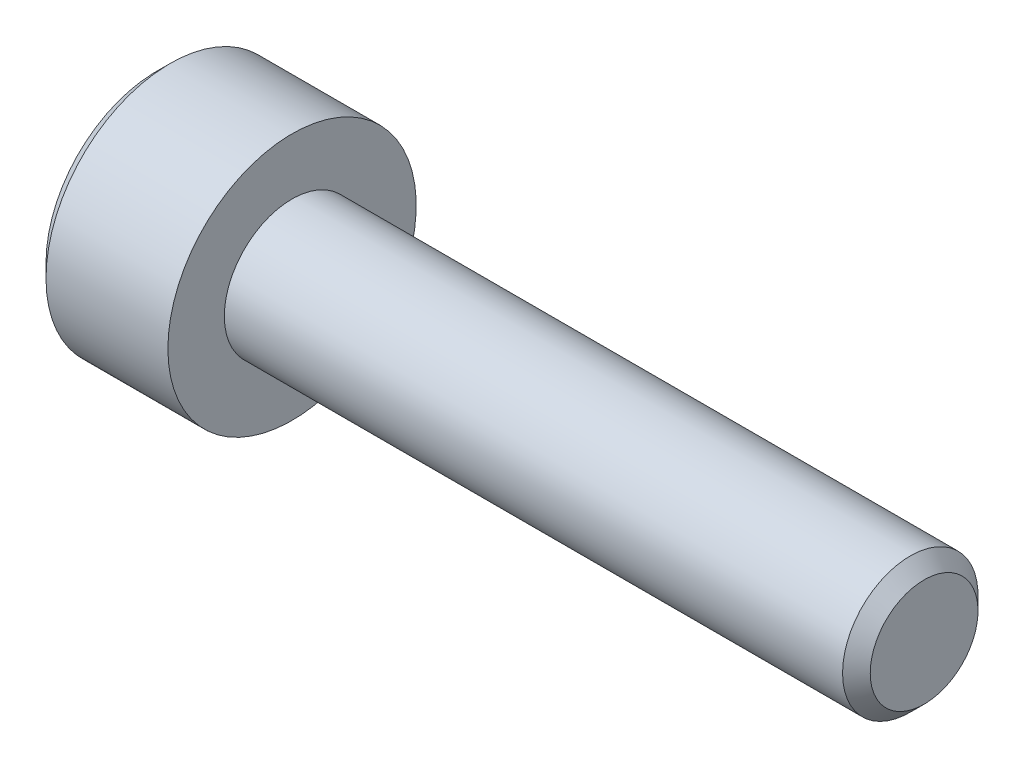
ISO-10303-21;
HEADER;
FILE_DESCRIPTION(('STEP AP214'),'2;1');
FILE_NAME('part.step','',(''),(''),'','','');
FILE_SCHEMA(('AUTOMOTIVE_DESIGN { 1 0 10303 214 1 1 1 1 }'));
ENDSEC;
DATA;
#1=APPLICATION_CONTEXT('core data for automotive mechanical design processes');
#2=APPLICATION_PROTOCOL_DEFINITION('international standard','automotive_design',2000,#1);
#3=PRODUCT_CONTEXT('',#1,'mechanical');
#4=PRODUCT('Part','Part','',(#3));
#5=PRODUCT_RELATED_PRODUCT_CATEGORY('part','',(#4));
#6=PRODUCT_DEFINITION_FORMATION('','',#4);
#7=PRODUCT_DEFINITION_CONTEXT('part definition',#1,'design');
#8=PRODUCT_DEFINITION('design','',#6,#7);
#9=PRODUCT_DEFINITION_SHAPE('','',#8);
#10=(LENGTH_UNIT() NAMED_UNIT(*) SI_UNIT(.MILLI.,.METRE.));
#11=(NAMED_UNIT(*) PLANE_ANGLE_UNIT() SI_UNIT($,.RADIAN.));
#12=(NAMED_UNIT(*) SI_UNIT($,.STERADIAN.) SOLID_ANGLE_UNIT());
#13=UNCERTAINTY_MEASURE_WITH_UNIT(LENGTH_MEASURE(1.E-05),#10,'distance_accuracy_value','');
#14=(GEOMETRIC_REPRESENTATION_CONTEXT(3) GLOBAL_UNCERTAINTY_ASSIGNED_CONTEXT((#13)) GLOBAL_UNIT_ASSIGNED_CONTEXT((#10,
#11,#12)) REPRESENTATION_CONTEXT('',''));
#15=CARTESIAN_POINT('',(0.,0.,0.));
#16=DIRECTION('',(0.,0.,1.));
#17=DIRECTION('',(1.,0.,0.));
#18=AXIS2_PLACEMENT_3D('',#15,#16,#17);
#19=CARTESIAN_POINT('',(-3.,-2.45000000000001,0.));
#20=DIRECTION('',(-1.,0.,0.));
#21=DIRECTION('',(0.,0.,1.));
#22=AXIS2_PLACEMENT_3D('',#19,#20,#21);
#23=PLANE('',#22);
#24=DIRECTION('',(0.,0.5,-0.866025403784439));
#25=VECTOR('',#24,1.);
#26=CARTESIAN_POINT('',(-3.,0.721687836487033,1.25));
#27=LINE('',#26,#25);
#28=CARTESIAN_POINT('',(-3.,0.721687836487033,1.25));
#29=VERTEX_POINT('',#28);
#30=CARTESIAN_POINT('',(-3.,1.44337567297406,0.));
#31=VERTEX_POINT('',#30);
#32=EDGE_CURVE('E59',#29,#31,#27,.T.);
#33=ORIENTED_EDGE('',*,*,#32,.F.);
#34=DIRECTION('',(0.,1.,0.));
#35=VECTOR('',#34,1.);
#36=CARTESIAN_POINT('',(-3.,-0.721687836487033,1.25));
#37=LINE('',#36,#35);
#38=CARTESIAN_POINT('',(-3.,-0.721687836487033,1.25));
#39=VERTEX_POINT('',#38);
#40=EDGE_CURVE('E142',#39,#29,#37,.T.);
#41=ORIENTED_EDGE('',*,*,#40,.F.);
#42=DIRECTION('',(0.,0.5,0.866025403784439));
#43=VECTOR('',#42,1.);
#44=CARTESIAN_POINT('',(-3.,-1.44337567297406,0.));
#45=LINE('',#44,#43);
#46=CARTESIAN_POINT('',(-3.,-1.44337567297406,0.));
#47=VERTEX_POINT('',#46);
#48=EDGE_CURVE('E140',#47,#39,#45,.T.);
#49=ORIENTED_EDGE('',*,*,#48,.F.);
#50=DIRECTION('',(0.,-0.5,0.866025403784439));
#51=VECTOR('',#50,1.);
#52=CARTESIAN_POINT('',(-3.,-0.721687836487032,-1.25));
#53=LINE('',#52,#51);
#54=CARTESIAN_POINT('',(-3.,-0.721687836487032,-1.25));
#55=VERTEX_POINT('',#54);
#56=EDGE_CURVE('E107',#55,#47,#53,.T.);
#57=ORIENTED_EDGE('',*,*,#56,.F.);
#58=DIRECTION('',(0.,-1.,0.));
#59=VECTOR('',#58,1.);
#60=CARTESIAN_POINT('',(-3.,0.721687836487033,-1.25));
#61=LINE('',#60,#59);
#62=CARTESIAN_POINT('',(-3.,0.721687836487033,-1.25));
#63=VERTEX_POINT('',#62);
#64=EDGE_CURVE('E136',#63,#55,#61,.T.);
#65=ORIENTED_EDGE('',*,*,#64,.F.);
#66=DIRECTION('',(0.,-0.5,-0.866025403784439));
#67=VECTOR('',#66,1.);
#68=CARTESIAN_POINT('',(-3.,1.44337567297406,0.));
#69=LINE('',#68,#67);
#70=EDGE_CURVE('E133',#31,#63,#69,.T.);
#71=ORIENTED_EDGE('',*,*,#70,.F.);
#72=EDGE_LOOP('',(#33,#41,#49,#57,#65,#71));
#73=FACE_BOUND('',#72,.T.);
#74=CARTESIAN_POINT('',(-3.,0.,0.));
#75=DIRECTION('',(-1.,0.,0.));
#76=DIRECTION('',(0.,0.,1.));
#77=AXIS2_PLACEMENT_3D('',#74,#75,#76);
#78=CIRCLE('',#77,2.45000000000001);
#79=CARTESIAN_POINT('',(-3.,0.,2.45000000000001));
#80=VERTEX_POINT('',#79);
#81=EDGE_CURVE('E146',#80,#80,#78,.T.);
#82=ORIENTED_EDGE('',*,*,#81,.T.);
#83=EDGE_LOOP('',(#82));
#84=FACE_BOUND('',#83,.T.);
#85=ADVANCED_FACE('F45',(#73,#84),#23,.T.);
#86=CARTESIAN_POINT('',(14.,0.,0.));
#87=DIRECTION('',(1.,0.,0.));
#88=DIRECTION('',(0.,0.,-1.));
#89=AXIS2_PLACEMENT_3D('',#86,#87,#88);
#90=PLANE('',#89);
#91=CARTESIAN_POINT('',(14.,0.,0.));
#92=DIRECTION('',(-1.,0.,0.));
#93=DIRECTION('',(0.,0.,1.));
#94=AXIS2_PLACEMENT_3D('',#91,#92,#93);
#95=CIRCLE('',#94,1.1935);
#96=CARTESIAN_POINT('',(14.,0.,1.1935));
#97=VERTEX_POINT('',#96);
#98=EDGE_CURVE('E11',#97,#97,#95,.T.);
#99=ORIENTED_EDGE('',*,*,#98,.F.);
#100=EDGE_LOOP('',(#99));
#101=FACE_BOUND('',#100,.T.);
#102=ADVANCED_FACE('F170',(#101),#90,.T.);
#103=CARTESIAN_POINT('',(13.6935,0.,0.));
#104=DIRECTION('',(-1.,0.,0.));
#105=DIRECTION('',(0.,0.,1.));
#106=AXIS2_PLACEMENT_3D('',#103,#104,#105);
#107=CONICAL_SURFACE('',#106,1.5,0.785398163397452);
#108=ORIENTED_EDGE('',*,*,#98,.T.);
#109=EDGE_LOOP('',(#108));
#110=FACE_BOUND('',#109,.T.);
#111=CARTESIAN_POINT('',(13.6935,0.,0.));
#112=DIRECTION('',(-1.,0.,0.));
#113=DIRECTION('',(0.,0.,1.));
#114=AXIS2_PLACEMENT_3D('',#111,#112,#113);
#115=CIRCLE('',#114,1.5);
#116=CARTESIAN_POINT('',(13.6935,0.,1.5));
#117=VERTEX_POINT('',#116);
#118=EDGE_CURVE('E52',#117,#117,#115,.T.);
#119=ORIENTED_EDGE('',*,*,#118,.F.);
#120=EDGE_LOOP('',(#119));
#121=FACE_BOUND('',#120,.T.);
#122=ADVANCED_FACE('F168',(#110,#121),#107,.T.);
#123=CARTESIAN_POINT('',(-3.85,0.,0.));
#124=DIRECTION('',(-1.,0.,0.));
#125=DIRECTION('',(0.,0.,1.));
#126=AXIS2_PLACEMENT_3D('',#123,#124,#125);
#127=CYLINDRICAL_SURFACE('',#126,1.5);
#128=ORIENTED_EDGE('',*,*,#118,.T.);
#129=EDGE_LOOP('',(#128));
#130=FACE_BOUND('',#129,.T.);
#131=CARTESIAN_POINT('',(0.,0.,0.));
#132=DIRECTION('',(-1.,0.,0.));
#133=DIRECTION('',(0.,0.,1.));
#134=AXIS2_PLACEMENT_3D('',#131,#132,#133);
#135=CIRCLE('',#134,1.5);
#136=CARTESIAN_POINT('',(0.,0.,1.5));
#137=VERTEX_POINT('',#136);
#138=EDGE_CURVE('E160',#137,#137,#135,.T.);
#139=ORIENTED_EDGE('',*,*,#138,.F.);
#140=EDGE_LOOP('',(#139));
#141=FACE_BOUND('',#140,.T.);
#142=ADVANCED_FACE('F165',(#130,#141),#127,.T.);
#143=CARTESIAN_POINT('',(0.,-1.5,0.));
#144=DIRECTION('',(1.,0.,0.));
#145=DIRECTION('',(0.,0.,-1.));
#146=AXIS2_PLACEMENT_3D('',#143,#144,#145);
#147=PLANE('',#146);
#148=ORIENTED_EDGE('',*,*,#138,.T.);
#149=EDGE_LOOP('',(#148));
#150=FACE_BOUND('',#149,.T.);
#151=CARTESIAN_POINT('',(0.,0.,0.));
#152=DIRECTION('',(-1.,0.,0.));
#153=DIRECTION('',(0.,0.,1.));
#154=AXIS2_PLACEMENT_3D('',#151,#152,#153);
#155=CIRCLE('',#154,2.75);
#156=CARTESIAN_POINT('',(0.,0.,2.75));
#157=VERTEX_POINT('',#156);
#158=EDGE_CURVE('E157',#157,#157,#155,.T.);
#159=ORIENTED_EDGE('',*,*,#158,.F.);
#160=EDGE_LOOP('',(#159));
#161=FACE_BOUND('',#160,.T.);
#162=ADVANCED_FACE('F178',(#150,#161),#147,.T.);
#163=CARTESIAN_POINT('',(-3.85,0.,0.));
#164=DIRECTION('',(-1.,0.,0.));
#165=DIRECTION('',(0.,0.,1.));
#166=AXIS2_PLACEMENT_3D('',#163,#164,#165);
#167=CYLINDRICAL_SURFACE('',#166,2.75);
#168=ORIENTED_EDGE('',*,*,#158,.T.);
#169=EDGE_LOOP('',(#168));
#170=FACE_BOUND('',#169,.T.);
#171=CARTESIAN_POINT('',(-2.7,0.,0.));
#172=DIRECTION('',(-1.,0.,0.));
#173=DIRECTION('',(0.,0.,1.));
#174=AXIS2_PLACEMENT_3D('',#171,#172,#173);
#175=CIRCLE('',#174,2.75);
#176=CARTESIAN_POINT('',(-2.7,0.,2.75));
#177=VERTEX_POINT('',#176);
#178=EDGE_CURVE('E154',#177,#177,#175,.T.);
#179=ORIENTED_EDGE('',*,*,#178,.F.);
#180=EDGE_LOOP('',(#179));
#181=FACE_BOUND('',#180,.T.);
#182=ADVANCED_FACE('F194',(#170,#181),#167,.T.);
#183=CARTESIAN_POINT('',(-3.,0.,0.));
#184=DIRECTION('',(1.,0.,0.));
#185=DIRECTION('',(0.,0.,-1.));
#186=AXIS2_PLACEMENT_3D('',#183,#184,#185);
#187=CONICAL_SURFACE('',#186,2.45000000000001,0.785398163397443);
#188=ORIENTED_EDGE('',*,*,#178,.T.);
#189=EDGE_LOOP('',(#188));
#190=FACE_BOUND('',#189,.T.);
#191=ORIENTED_EDGE('',*,*,#81,.F.);
#192=EDGE_LOOP('',(#191));
#193=FACE_BOUND('',#192,.T.);
#194=ADVANCED_FACE('F192',(#190,#193),#187,.T.);
#195=CARTESIAN_POINT('',(-1.5,0.721687836487033,1.25));
#196=DIRECTION('',(0.,0.866025403784439,0.5));
#197=DIRECTION('',(0.,-0.5,0.866025403784439));
#198=AXIS2_PLACEMENT_3D('',#195,#196,#197);
#199=PLANE('',#198);
#200=ORIENTED_EDGE('',*,*,#32,.T.);
#201=DIRECTION('',(-1.,0.,0.));
#202=VECTOR('',#201,1.);
#203=CARTESIAN_POINT('',(-1.5,1.44337567297406,0.));
#204=LINE('',#203,#202);
#205=CARTESIAN_POINT('',(-1.5,1.44337567297406,0.));
#206=VERTEX_POINT('',#205);
#207=EDGE_CURVE('E89',#206,#31,#204,.T.);
#208=ORIENTED_EDGE('',*,*,#207,.F.);
#209=DIRECTION('',(0.,0.5,-0.866025403784439));
#210=VECTOR('',#209,1.);
#211=CARTESIAN_POINT('',(-1.5,0.721687836487033,1.25));
#212=LINE('',#211,#210);
#213=CARTESIAN_POINT('',(-1.5,0.721687836487033,1.25));
#214=VERTEX_POINT('',#213);
#215=EDGE_CURVE('E144',#214,#206,#212,.T.);
#216=ORIENTED_EDGE('',*,*,#215,.F.);
#217=DIRECTION('',(-1.,0.,0.));
#218=VECTOR('',#217,1.);
#219=CARTESIAN_POINT('',(-1.5,0.721687836487033,1.25));
#220=LINE('',#219,#218);
#221=EDGE_CURVE('E67',#214,#29,#220,.T.);
#222=ORIENTED_EDGE('',*,*,#221,.T.);
#223=EDGE_LOOP('',(#200,#208,#216,#222));
#224=FACE_BOUND('',#223,.T.);
#225=ADVANCED_FACE('F193',(#224),#199,.F.);
#226=CARTESIAN_POINT('',(-1.5,-0.721687836487033,1.25));
#227=DIRECTION('',(0.,0.,1.));
#228=DIRECTION('',(0.,-1.,0.));
#229=AXIS2_PLACEMENT_3D('',#226,#227,#228);
#230=PLANE('',#229);
#231=ORIENTED_EDGE('',*,*,#40,.T.);
#232=ORIENTED_EDGE('',*,*,#221,.F.);
#233=DIRECTION('',(0.,1.,0.));
#234=VECTOR('',#233,1.);
#235=CARTESIAN_POINT('',(-1.5,-0.721687836487033,1.25));
#236=LINE('',#235,#234);
#237=CARTESIAN_POINT('',(-1.5,-0.721687836487033,1.25));
#238=VERTEX_POINT('',#237);
#239=EDGE_CURVE('E119',#238,#214,#236,.T.);
#240=ORIENTED_EDGE('',*,*,#239,.F.);
#241=DIRECTION('',(-1.,0.,0.));
#242=VECTOR('',#241,1.);
#243=CARTESIAN_POINT('',(-1.5,-0.721687836487033,1.25));
#244=LINE('',#243,#242);
#245=EDGE_CURVE('E111',#238,#39,#244,.T.);
#246=ORIENTED_EDGE('',*,*,#245,.T.);
#247=EDGE_LOOP('',(#231,#232,#240,#246));
#248=FACE_BOUND('',#247,.T.);
#249=ADVANCED_FACE('F200',(#248),#230,.F.);
#250=CARTESIAN_POINT('',(-1.5,-1.44337567297406,0.));
#251=DIRECTION('',(0.,-0.866025403784439,0.5));
#252=DIRECTION('',(0.,-0.5,-0.866025403784439));
#253=AXIS2_PLACEMENT_3D('',#250,#251,#252);
#254=PLANE('',#253);
#255=ORIENTED_EDGE('',*,*,#48,.T.);
#256=ORIENTED_EDGE('',*,*,#245,.F.);
#257=DIRECTION('',(0.,0.5,0.866025403784439));
#258=VECTOR('',#257,1.);
#259=CARTESIAN_POINT('',(-1.5,-1.44337567297406,0.));
#260=LINE('',#259,#258);
#261=CARTESIAN_POINT('',(-1.5,-1.44337567297406,0.));
#262=VERTEX_POINT('',#261);
#263=EDGE_CURVE('E115',#262,#238,#260,.T.);
#264=ORIENTED_EDGE('',*,*,#263,.F.);
#265=DIRECTION('',(-1.,0.,0.));
#266=VECTOR('',#265,1.);
#267=CARTESIAN_POINT('',(-1.5,-1.44337567297406,0.));
#268=LINE('',#267,#266);
#269=EDGE_CURVE('E100',#262,#47,#268,.T.);
#270=ORIENTED_EDGE('',*,*,#269,.T.);
#271=EDGE_LOOP('',(#255,#256,#264,#270));
#272=FACE_BOUND('',#271,.T.);
#273=ADVANCED_FACE('F116',(#272),#254,.F.);
#274=CARTESIAN_POINT('',(-1.5,-0.721687836487032,-1.25));
#275=DIRECTION('',(0.,-0.866025403784438,-0.5));
#276=DIRECTION('',(0.,0.5,-0.866025403784439));
#277=AXIS2_PLACEMENT_3D('',#274,#275,#276);
#278=PLANE('',#277);
#279=ORIENTED_EDGE('',*,*,#56,.T.);
#280=ORIENTED_EDGE('',*,*,#269,.F.);
#281=DIRECTION('',(0.,-0.5,0.866025403784439));
#282=VECTOR('',#281,1.);
#283=CARTESIAN_POINT('',(-1.5,-0.721687836487032,-1.25));
#284=LINE('',#283,#282);
#285=CARTESIAN_POINT('',(-1.5,-0.721687836487032,-1.25));
#286=VERTEX_POINT('',#285);
#287=EDGE_CURVE('E104',#286,#262,#284,.T.);
#288=ORIENTED_EDGE('',*,*,#287,.F.);
#289=DIRECTION('',(-1.,0.,0.));
#290=VECTOR('',#289,1.);
#291=CARTESIAN_POINT('',(-1.5,-0.721687836487032,-1.25));
#292=LINE('',#291,#290);
#293=EDGE_CURVE('E112',#286,#55,#292,.T.);
#294=ORIENTED_EDGE('',*,*,#293,.T.);
#295=EDGE_LOOP('',(#279,#280,#288,#294));
#296=FACE_BOUND('',#295,.T.);
#297=ADVANCED_FACE('F102',(#296),#278,.F.);
#298=CARTESIAN_POINT('',(-1.5,0.721687836487033,-1.25));
#299=DIRECTION('',(0.,0.,-1.));
#300=DIRECTION('',(-1.,0.,0.));
#301=AXIS2_PLACEMENT_3D('',#298,#299,#300);
#302=PLANE('',#301);
#303=ORIENTED_EDGE('',*,*,#64,.T.);
#304=ORIENTED_EDGE('',*,*,#293,.F.);
#305=DIRECTION('',(0.,-1.,0.));
#306=VECTOR('',#305,1.);
#307=CARTESIAN_POINT('',(-1.5,0.721687836487033,-1.25));
#308=LINE('',#307,#306);
#309=CARTESIAN_POINT('',(-1.5,0.721687836487033,-1.25));
#310=VERTEX_POINT('',#309);
#311=EDGE_CURVE('E125',#310,#286,#308,.T.);
#312=ORIENTED_EDGE('',*,*,#311,.F.);
#313=DIRECTION('',(-1.,0.,0.));
#314=VECTOR('',#313,1.);
#315=CARTESIAN_POINT('',(-1.5,0.721687836487033,-1.25));
#316=LINE('',#315,#314);
#317=EDGE_CURVE('E149',#310,#63,#316,.T.);
#318=ORIENTED_EDGE('',*,*,#317,.T.);
#319=EDGE_LOOP('',(#303,#304,#312,#318));
#320=FACE_BOUND('',#319,.T.);
#321=ADVANCED_FACE('F259',(#320),#302,.F.);
#322=CARTESIAN_POINT('',(-1.5,1.44337567297406,0.));
#323=DIRECTION('',(0.,0.866025403784439,-0.5));
#324=DIRECTION('',(0.,0.5,0.866025403784439));
#325=AXIS2_PLACEMENT_3D('',#322,#323,#324);
#326=PLANE('',#325);
#327=ORIENTED_EDGE('',*,*,#70,.T.);
#328=ORIENTED_EDGE('',*,*,#317,.F.);
#329=DIRECTION('',(0.,-0.5,-0.866025403784439));
#330=VECTOR('',#329,1.);
#331=CARTESIAN_POINT('',(-1.5,1.44337567297406,0.));
#332=LINE('',#331,#330);
#333=EDGE_CURVE('E127',#206,#310,#332,.T.);
#334=ORIENTED_EDGE('',*,*,#333,.F.);
#335=ORIENTED_EDGE('',*,*,#207,.T.);
#336=EDGE_LOOP('',(#327,#328,#334,#335));
#337=FACE_BOUND('',#336,.T.);
#338=ADVANCED_FACE('F268',(#337),#326,.F.);
#339=CARTESIAN_POINT('',(-1.5,0.,0.));
#340=DIRECTION('',(-1.,0.,0.));
#341=DIRECTION('',(0.,0.,1.));
#342=AXIS2_PLACEMENT_3D('',#339,#340,#341);
#343=PLANE('',#342);
#344=ORIENTED_EDGE('',*,*,#215,.T.);
#345=ORIENTED_EDGE('',*,*,#333,.T.);
#346=ORIENTED_EDGE('',*,*,#311,.T.);
#347=ORIENTED_EDGE('',*,*,#287,.T.);
#348=ORIENTED_EDGE('',*,*,#263,.T.);
#349=ORIENTED_EDGE('',*,*,#239,.T.);
#350=EDGE_LOOP('',(#344,#345,#346,#347,#348,#349));
#351=FACE_BOUND('',#350,.T.);
#352=ADVANCED_FACE('F122',(#351),#343,.T.);
#353=CLOSED_SHELL('',(#85,#102,#122,#142,#162,#182,#194,#225,#249,#273,#297,#321,#338,#352));
#354=MANIFOLD_SOLID_BREP('B2',#353);
#355=ADVANCED_BREP_SHAPE_REPRESENTATION('',(#18,#354),#14);
#356=SHAPE_DEFINITION_REPRESENTATION(#9,#355);
ENDSEC;
END-ISO-10303-21;
